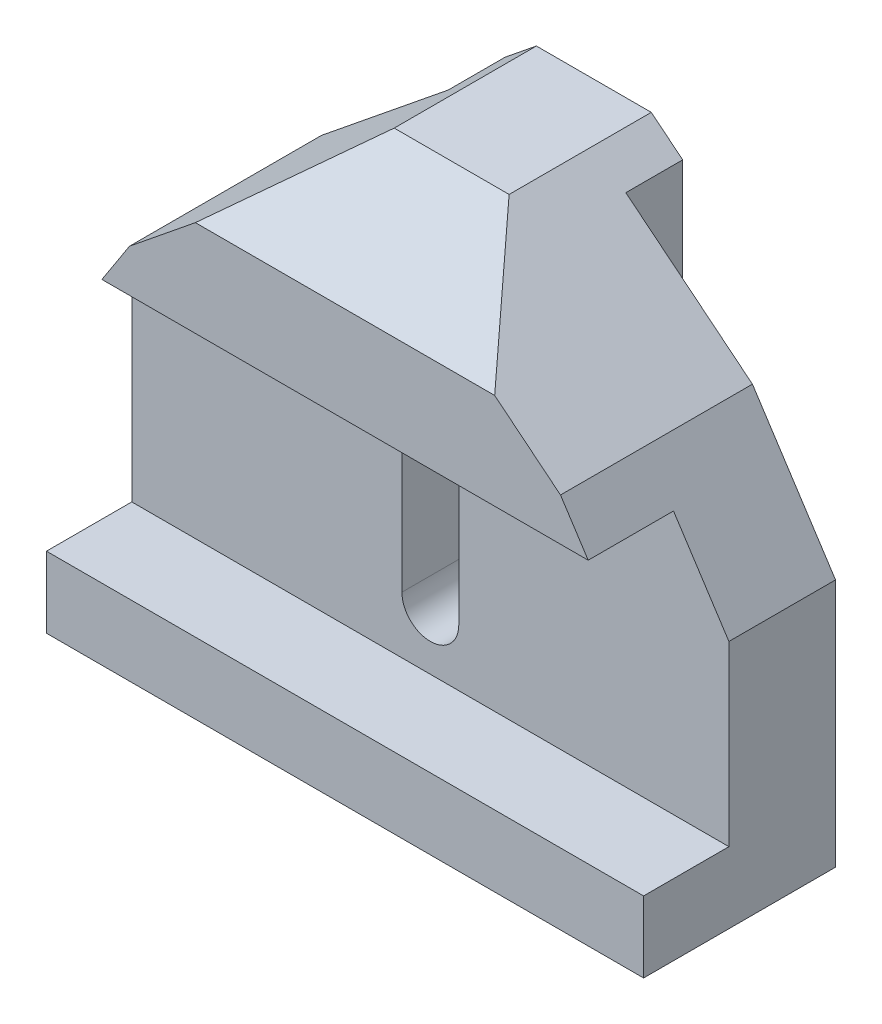
ISO-10303-21;
HEADER;
FILE_DESCRIPTION(('STEP AP214'),'2;1');
FILE_NAME('part.step','',(''),(''),'','','');
FILE_SCHEMA(('AUTOMOTIVE_DESIGN { 1 0 10303 214 1 1 1 1 }'));
ENDSEC;
DATA;
#1=APPLICATION_CONTEXT('core data for automotive mechanical design processes');
#2=APPLICATION_PROTOCOL_DEFINITION('international standard','automotive_design',2000,#1);
#3=PRODUCT_CONTEXT('',#1,'mechanical');
#4=PRODUCT('Part','Part','',(#3));
#5=PRODUCT_RELATED_PRODUCT_CATEGORY('part','',(#4));
#6=PRODUCT_DEFINITION_FORMATION('','',#4);
#7=PRODUCT_DEFINITION_CONTEXT('part definition',#1,'design');
#8=PRODUCT_DEFINITION('design','',#6,#7);
#9=PRODUCT_DEFINITION_SHAPE('','',#8);
#10=(LENGTH_UNIT() NAMED_UNIT(*) SI_UNIT(.MILLI.,.METRE.));
#11=(NAMED_UNIT(*) PLANE_ANGLE_UNIT() SI_UNIT($,.RADIAN.));
#12=(NAMED_UNIT(*) SI_UNIT($,.STERADIAN.) SOLID_ANGLE_UNIT());
#13=UNCERTAINTY_MEASURE_WITH_UNIT(LENGTH_MEASURE(1.E-05),#10,'distance_accuracy_value','');
#14=(GEOMETRIC_REPRESENTATION_CONTEXT(3) GLOBAL_UNCERTAINTY_ASSIGNED_CONTEXT((#13)) GLOBAL_UNIT_ASSIGNED_CONTEXT((#10,
#11,#12)) REPRESENTATION_CONTEXT('',''));
#15=CARTESIAN_POINT('',(0.,0.,0.));
#16=DIRECTION('',(0.,0.,1.));
#17=DIRECTION('',(1.,0.,0.));
#18=AXIS2_PLACEMENT_3D('',#15,#16,#17);
#19=CARTESIAN_POINT('',(12.5,71.,0.));
#20=DIRECTION('',(0.,-1.,0.));
#21=DIRECTION('',(0.,0.,-1.));
#22=AXIS2_PLACEMENT_3D('',#19,#20,#21);
#23=PLANE('',#22);
#24=DIRECTION('',(0.,0.,-1.));
#25=VECTOR('',#24,1.);
#26=CARTESIAN_POINT('',(-8.08251450481393,71.,35.001));
#27=LINE('',#26,#25);
#28=CARTESIAN_POINT('',(-8.08251450481393,71.,19.9999999999999));
#29=VERTEX_POINT('',#28);
#30=CARTESIAN_POINT('',(-8.08251450481393,71.,0.));
#31=VERTEX_POINT('',#30);
#32=EDGE_CURVE('E344',#29,#31,#27,.T.);
#33=ORIENTED_EDGE('',*,*,#32,.F.);
#34=DIRECTION('',(1.,0.,0.));
#35=VECTOR('',#34,1.);
#36=CARTESIAN_POINT('',(8.08251450481392,71.,19.9999999999999));
#37=LINE('',#36,#35);
#38=CARTESIAN_POINT('',(8.08251450481393,71.,19.9999999999999));
#39=VERTEX_POINT('',#38);
#40=EDGE_CURVE('E55',#29,#39,#37,.T.);
#41=ORIENTED_EDGE('',*,*,#40,.T.);
#42=DIRECTION('',(0.,0.,-1.));
#43=VECTOR('',#42,1.);
#44=CARTESIAN_POINT('',(8.08251450481393,71.,35.001));
#45=LINE('',#44,#43);
#46=CARTESIAN_POINT('',(8.08251450481393,71.,0.));
#47=VERTEX_POINT('',#46);
#48=EDGE_CURVE('E198',#39,#47,#45,.T.);
#49=ORIENTED_EDGE('',*,*,#48,.T.);
#50=DIRECTION('',(-1.,0.,0.));
#51=VECTOR('',#50,1.);
#52=CARTESIAN_POINT('',(12.5,71.,0.));
#53=LINE('',#52,#51);
#54=EDGE_CURVE('E257',#47,#31,#53,.T.);
#55=ORIENTED_EDGE('',*,*,#54,.T.);
#56=EDGE_LOOP('',(#33,#41,#49,#55));
#57=FACE_BOUND('',#56,.T.);
#58=ADVANCED_FACE('F43',(#57),#23,.F.);
#59=CARTESIAN_POINT('',(42.,0.,35.));
#60=DIRECTION('',(0.,0.,1.));
#61=DIRECTION('',(0.,-1.,0.));
#62=AXIS2_PLACEMENT_3D('',#59,#60,#61);
#63=PLANE('',#62);
#64=DIRECTION('',(0.777145961456972,-0.629320391049836,0.));
#65=VECTOR('',#64,1.);
#66=CARTESIAN_POINT('',(37.9252724500795,46.8338111094206,35.));
#67=LINE('',#66,#65);
#68=CARTESIAN_POINT('',(21.0527789736077,60.4968869268543,35.));
#69=VERTEX_POINT('',#68);
#70=CARTESIAN_POINT('',(30.310663322445,53.,35.));
#71=VERTEX_POINT('',#70);
#72=EDGE_CURVE('E281',#69,#71,#67,.T.);
#73=ORIENTED_EDGE('',*,*,#72,.F.);
#74=DIRECTION('',(-1.,0.,0.));
#75=VECTOR('',#74,1.);
#76=CARTESIAN_POINT('',(-8.08251450481393,60.4968869268543,35.));
#77=LINE('',#76,#75);
#78=CARTESIAN_POINT('',(-21.0527789736077,60.4968869268543,35.));
#79=VERTEX_POINT('',#78);
#80=EDGE_CURVE('E271',#69,#79,#77,.T.);
#81=ORIENTED_EDGE('',*,*,#80,.T.);
#82=DIRECTION('',(-0.777145961456972,-0.629320391049836,0.));
#83=VECTOR('',#82,1.);
#84=CARTESIAN_POINT('',(-37.9252724500795,46.8338111094206,35.));
#85=LINE('',#84,#83);
#86=CARTESIAN_POINT('',(-30.3106633224449,53.,35.));
#87=VERTEX_POINT('',#86);
#88=EDGE_CURVE('E276',#79,#87,#85,.T.);
#89=ORIENTED_EDGE('',*,*,#88,.T.);
#90=DIRECTION('',(-0.544639035015023,-0.838670567945427,0.));
#91=VECTOR('',#90,1.);
#92=CARTESIAN_POINT('',(-45.5285150133375,29.5665633566678,35.));
#93=LINE('',#92,#91);
#94=CARTESIAN_POINT('',(-34.20710888163,47.,35.));
#95=VERTEX_POINT('',#94);
#96=EDGE_CURVE('E332',#87,#95,#93,.T.);
#97=ORIENTED_EDGE('',*,*,#96,.T.);
#98=DIRECTION('',(-1.,0.,0.));
#99=VECTOR('',#98,1.);
#100=CARTESIAN_POINT('',(42.,47.,35.));
#101=LINE('',#100,#99);
#102=CARTESIAN_POINT('',(34.20710888163,47.,35.));
#103=VERTEX_POINT('',#102);
#104=EDGE_CURVE('E249',#103,#95,#101,.T.);
#105=ORIENTED_EDGE('',*,*,#104,.F.);
#106=DIRECTION('',(0.544639035015023,-0.838670567945427,0.));
#107=VECTOR('',#106,1.);
#108=CARTESIAN_POINT('',(45.5285150133375,29.5665633566678,35.));
#109=LINE('',#108,#107);
#110=EDGE_CURVE('E374',#71,#103,#109,.T.);
#111=ORIENTED_EDGE('',*,*,#110,.F.);
#112=EDGE_LOOP('',(#73,#81,#89,#97,#105,#111));
#113=FACE_BOUND('',#112,.T.);
#114=ADVANCED_FACE('F280',(#113),#63,.T.);
#115=CARTESIAN_POINT('',(12.5,0.,0.));
#116=DIRECTION('',(0.,0.,1.));
#117=DIRECTION('',(1.,0.,0.));
#118=AXIS2_PLACEMENT_3D('',#115,#116,#117);
#119=PLANE('',#118);
#120=CARTESIAN_POINT('',(0.,18.,0.));
#121=DIRECTION('',(0.,0.,1.));
#122=DIRECTION('',(1.,0.,0.));
#123=AXIS2_PLACEMENT_3D('',#120,#121,#122);
#124=CIRCLE('',#123,4.);
#125=CARTESIAN_POINT('',(-4.,18.,0.));
#126=VERTEX_POINT('',#125);
#127=CARTESIAN_POINT('',(4.,18.,0.));
#128=VERTEX_POINT('',#127);
#129=EDGE_CURVE('E320',#126,#128,#124,.T.);
#130=ORIENTED_EDGE('',*,*,#129,.T.);
#131=DIRECTION('',(0.,-1.,0.));
#132=VECTOR('',#131,1.);
#133=CARTESIAN_POINT('',(4.,39.,0.));
#134=LINE('',#133,#132);
#135=CARTESIAN_POINT('',(4.,39.,0.));
#136=VERTEX_POINT('',#135);
#137=EDGE_CURVE('E319',#136,#128,#134,.T.);
#138=ORIENTED_EDGE('',*,*,#137,.F.);
#139=CARTESIAN_POINT('',(0.,39.,0.));
#140=DIRECTION('',(0.,0.,1.));
#141=DIRECTION('',(1.,0.,0.));
#142=AXIS2_PLACEMENT_3D('',#139,#140,#141);
#143=CIRCLE('',#142,4.);
#144=CARTESIAN_POINT('',(-4.,39.,0.));
#145=VERTEX_POINT('',#144);
#146=EDGE_CURVE('E308',#136,#145,#143,.T.);
#147=ORIENTED_EDGE('',*,*,#146,.T.);
#148=DIRECTION('',(0.,-1.,0.));
#149=VECTOR('',#148,1.);
#150=CARTESIAN_POINT('',(-4.,39.,0.));
#151=LINE('',#150,#149);
#152=EDGE_CURVE('E314',#145,#126,#151,.T.);
#153=ORIENTED_EDGE('',*,*,#152,.T.);
#154=EDGE_LOOP('',(#130,#138,#147,#153));
#155=FACE_BOUND('',#154,.T.);
#156=ORIENTED_EDGE('',*,*,#54,.F.);
#157=DIRECTION('',(0.777145961456972,-0.629320391049836,0.));
#158=VECTOR('',#157,1.);
#159=CARTESIAN_POINT('',(37.9252724500795,46.8338111094206,0.));
#160=LINE('',#159,#158);
#161=CARTESIAN_POINT('',(12.5,67.4227907791278,0.));
#162=VERTEX_POINT('',#161);
#163=EDGE_CURVE('E206',#47,#162,#160,.T.);
#164=ORIENTED_EDGE('',*,*,#163,.T.);
#165=DIRECTION('',(0.,1.,0.));
#166=VECTOR('',#165,1.);
#167=CARTESIAN_POINT('',(12.5,0.,0.));
#168=LINE('',#167,#166);
#169=CARTESIAN_POINT('',(12.5,0.,0.));
#170=VERTEX_POINT('',#169);
#171=EDGE_CURVE('E260',#170,#162,#168,.T.);
#172=ORIENTED_EDGE('',*,*,#171,.F.);
#173=DIRECTION('',(-1.,0.,0.));
#174=VECTOR('',#173,1.);
#175=CARTESIAN_POINT('',(12.5,0.,0.));
#176=LINE('',#175,#174);
#177=CARTESIAN_POINT('',(-12.5,0.,0.));
#178=VERTEX_POINT('',#177);
#179=EDGE_CURVE('E268',#170,#178,#176,.T.);
#180=ORIENTED_EDGE('',*,*,#179,.T.);
#181=DIRECTION('',(0.,1.,0.));
#182=VECTOR('',#181,1.);
#183=CARTESIAN_POINT('',(-12.5,0.,0.));
#184=LINE('',#183,#182);
#185=CARTESIAN_POINT('',(-12.5,67.4227907791278,0.));
#186=VERTEX_POINT('',#185);
#187=EDGE_CURVE('E254',#178,#186,#184,.T.);
#188=ORIENTED_EDGE('',*,*,#187,.T.);
#189=DIRECTION('',(-0.777145961456972,-0.629320391049836,0.));
#190=VECTOR('',#189,1.);
#191=CARTESIAN_POINT('',(-37.9252724500795,46.8338111094206,0.));
#192=LINE('',#191,#190);
#193=EDGE_CURVE('E293',#31,#186,#192,.T.);
#194=ORIENTED_EDGE('',*,*,#193,.F.);
#195=EDGE_LOOP('',(#156,#164,#172,#180,#188,#194));
#196=FACE_BOUND('',#195,.T.);
#197=ADVANCED_FACE('F360',(#155,#196),#119,.F.);
#198=CARTESIAN_POINT('',(12.5,0.,0.));
#199=DIRECTION('',(1.,0.,0.));
#200=DIRECTION('',(0.,0.,-1.));
#201=AXIS2_PLACEMENT_3D('',#198,#199,#200);
#202=PLANE('',#201);
#203=ORIENTED_EDGE('',*,*,#171,.T.);
#204=DIRECTION('',(0.,0.,-1.));
#205=VECTOR('',#204,1.);
#206=CARTESIAN_POINT('',(12.5,67.4227907791278,35.001));
#207=LINE('',#206,#205);
#208=CARTESIAN_POINT('',(12.5,67.4227907791278,8.));
#209=VERTEX_POINT('',#208);
#210=EDGE_CURVE('E295',#209,#162,#207,.T.);
#211=ORIENTED_EDGE('',*,*,#210,.F.);
#212=DIRECTION('',(0.,-1.,0.));
#213=VECTOR('',#212,1.);
#214=CARTESIAN_POINT('',(12.5,0.,7.99999999999999));
#215=LINE('',#214,#213);
#216=CARTESIAN_POINT('',(12.5,0.,8.));
#217=VERTEX_POINT('',#216);
#218=EDGE_CURVE('E252',#209,#217,#215,.T.);
#219=ORIENTED_EDGE('',*,*,#218,.T.);
#220=DIRECTION('',(0.,0.,-1.));
#221=VECTOR('',#220,1.);
#222=CARTESIAN_POINT('',(12.5,0.,0.));
#223=LINE('',#222,#221);
#224=EDGE_CURVE('E255',#217,#170,#223,.T.);
#225=ORIENTED_EDGE('',*,*,#224,.T.);
#226=EDGE_LOOP('',(#203,#211,#219,#225));
#227=FACE_BOUND('',#226,.T.);
#228=ADVANCED_FACE('F394',(#227),#202,.T.);
#229=CARTESIAN_POINT('',(42.,0.,7.99999999999999));
#230=DIRECTION('',(0.,0.,-1.));
#231=DIRECTION('',(0.,1.,0.));
#232=AXIS2_PLACEMENT_3D('',#229,#230,#231);
#233=PLANE('',#232);
#234=DIRECTION('',(0.,-1.,0.));
#235=VECTOR('',#234,1.);
#236=CARTESIAN_POINT('',(-42.,0.,7.99999999999999));
#237=LINE('',#236,#235);
#238=CARTESIAN_POINT('',(-42.,35.,8.));
#239=VERTEX_POINT('',#238);
#240=CARTESIAN_POINT('',(-42.,0.,8.));
#241=VERTEX_POINT('',#240);
#242=EDGE_CURVE('E223',#239,#241,#237,.T.);
#243=ORIENTED_EDGE('',*,*,#242,.F.);
#244=DIRECTION('',(0.544639035015023,0.838670567945427,0.));
#245=VECTOR('',#244,1.);
#246=CARTESIAN_POINT('',(-45.5285150133375,29.5665633566678,7.99999999999999));
#247=LINE('',#246,#245);
#248=CARTESIAN_POINT('',(-30.310663322445,53.,8.));
#249=VERTEX_POINT('',#248);
#250=EDGE_CURVE('E327',#239,#249,#247,.T.);
#251=ORIENTED_EDGE('',*,*,#250,.T.);
#252=DIRECTION('',(0.777145961456972,0.629320391049836,0.));
#253=VECTOR('',#252,1.);
#254=CARTESIAN_POINT('',(-37.9252724500795,46.8338111094206,8.));
#255=LINE('',#254,#253);
#256=CARTESIAN_POINT('',(-12.5,67.4227907791278,8.));
#257=VERTEX_POINT('',#256);
#258=EDGE_CURVE('E288',#249,#257,#255,.T.);
#259=ORIENTED_EDGE('',*,*,#258,.T.);
#260=DIRECTION('',(0.,-1.,0.));
#261=VECTOR('',#260,1.);
#262=CARTESIAN_POINT('',(-12.5,0.,7.99999999999999));
#263=LINE('',#262,#261);
#264=CARTESIAN_POINT('',(-12.5,0.,8.));
#265=VERTEX_POINT('',#264);
#266=EDGE_CURVE('E253',#257,#265,#263,.T.);
#267=ORIENTED_EDGE('',*,*,#266,.T.);
#268=DIRECTION('',(-1.,0.,0.));
#269=VECTOR('',#268,1.);
#270=CARTESIAN_POINT('',(42.,0.,8.));
#271=LINE('',#270,#269);
#272=EDGE_CURVE('E221',#265,#241,#271,.T.);
#273=ORIENTED_EDGE('',*,*,#272,.T.);
#274=EDGE_LOOP('',(#243,#251,#259,#267,#273));
#275=FACE_BOUND('',#274,.T.);
#276=ADVANCED_FACE('F366',(#275),#233,.T.);
#277=CARTESIAN_POINT('',(42.,47.,0.));
#278=DIRECTION('',(0.,1.,0.));
#279=DIRECTION('',(0.,0.,1.));
#280=AXIS2_PLACEMENT_3D('',#277,#278,#279);
#281=PLANE('',#280);
#282=DIRECTION('',(0.,0.,1.));
#283=VECTOR('',#282,1.);
#284=CARTESIAN_POINT('',(34.20710888163,47.,35.001));
#285=LINE('',#284,#283);
#286=CARTESIAN_POINT('',(34.20710888163,47.,23.));
#287=VERTEX_POINT('',#286);
#288=EDGE_CURVE('E192',#287,#103,#285,.T.);
#289=ORIENTED_EDGE('',*,*,#288,.T.);
#290=ORIENTED_EDGE('',*,*,#104,.T.);
#291=DIRECTION('',(0.,0.,1.));
#292=VECTOR('',#291,1.);
#293=CARTESIAN_POINT('',(-34.20710888163,47.,35.001));
#294=LINE('',#293,#292);
#295=CARTESIAN_POINT('',(-34.2071088816299,47.,23.));
#296=VERTEX_POINT('',#295);
#297=EDGE_CURVE('E333',#296,#95,#294,.T.);
#298=ORIENTED_EDGE('',*,*,#297,.F.);
#299=DIRECTION('',(-1.,0.,0.));
#300=VECTOR('',#299,1.);
#301=CARTESIAN_POINT('',(42.,47.,23.));
#302=LINE('',#301,#300);
#303=EDGE_CURVE('E247',#287,#296,#302,.T.);
#304=ORIENTED_EDGE('',*,*,#303,.F.);
#305=EDGE_LOOP('',(#289,#290,#298,#304));
#306=FACE_BOUND('',#305,.T.);
#307=ADVANCED_FACE('F372',(#306),#281,.F.);
#308=CARTESIAN_POINT('',(42.,0.,23.));
#309=DIRECTION('',(0.,0.,-1.));
#310=DIRECTION('',(0.,1.,0.));
#311=AXIS2_PLACEMENT_3D('',#308,#309,#310);
#312=PLANE('',#311);
#313=DIRECTION('',(-0.544639035015023,0.838670567945427,0.));
#314=VECTOR('',#313,1.);
#315=CARTESIAN_POINT('',(45.5285150133375,29.5665633566678,23.));
#316=LINE('',#315,#314);
#317=CARTESIAN_POINT('',(42.,35.,23.));
#318=VERTEX_POINT('',#317);
#319=EDGE_CURVE('E184',#318,#287,#316,.T.);
#320=ORIENTED_EDGE('',*,*,#319,.T.);
#321=ORIENTED_EDGE('',*,*,#303,.T.);
#322=DIRECTION('',(0.544639035015023,0.838670567945427,0.));
#323=VECTOR('',#322,1.);
#324=CARTESIAN_POINT('',(-45.5285150133375,29.5665633566678,23.));
#325=LINE('',#324,#323);
#326=CARTESIAN_POINT('',(-42.,35.,23.));
#327=VERTEX_POINT('',#326);
#328=EDGE_CURVE('E342',#327,#296,#325,.T.);
#329=ORIENTED_EDGE('',*,*,#328,.F.);
#330=DIRECTION('',(0.,-1.,0.));
#331=VECTOR('',#330,1.);
#332=CARTESIAN_POINT('',(-42.,0.,23.));
#333=LINE('',#332,#331);
#334=CARTESIAN_POINT('',(-42.,10.,23.));
#335=VERTEX_POINT('',#334);
#336=EDGE_CURVE('E226',#327,#335,#333,.T.);
#337=ORIENTED_EDGE('',*,*,#336,.T.);
#338=DIRECTION('',(-1.,0.,0.));
#339=VECTOR('',#338,1.);
#340=CARTESIAN_POINT('',(42.,10.,23.));
#341=LINE('',#340,#339);
#342=CARTESIAN_POINT('',(42.,10.,23.));
#343=VERTEX_POINT('',#342);
#344=EDGE_CURVE('E211',#343,#335,#341,.T.);
#345=ORIENTED_EDGE('',*,*,#344,.F.);
#346=DIRECTION('',(0.,-1.,0.));
#347=VECTOR('',#346,1.);
#348=CARTESIAN_POINT('',(42.,0.,23.));
#349=LINE('',#348,#347);
#350=EDGE_CURVE('E203',#318,#343,#349,.T.);
#351=ORIENTED_EDGE('',*,*,#350,.F.);
#352=EDGE_LOOP('',(#320,#321,#329,#337,#345,#351));
#353=FACE_BOUND('',#352,.T.);
#354=CARTESIAN_POINT('',(0.,39.,23.));
#355=DIRECTION('',(0.,0.,-1.));
#356=DIRECTION('',(0.,1.,0.));
#357=AXIS2_PLACEMENT_3D('',#354,#355,#356);
#358=CIRCLE('',#357,4.);
#359=CARTESIAN_POINT('',(-4.,39.,23.));
#360=VERTEX_POINT('',#359);
#361=CARTESIAN_POINT('',(4.,39.,23.));
#362=VERTEX_POINT('',#361);
#363=EDGE_CURVE('E322',#360,#362,#358,.T.);
#364=ORIENTED_EDGE('',*,*,#363,.T.);
#365=DIRECTION('',(0.,1.,0.));
#366=VECTOR('',#365,1.);
#367=CARTESIAN_POINT('',(4.,39.,23.));
#368=LINE('',#367,#366);
#369=CARTESIAN_POINT('',(4.,18.,23.));
#370=VERTEX_POINT('',#369);
#371=EDGE_CURVE('E325',#370,#362,#368,.T.);
#372=ORIENTED_EDGE('',*,*,#371,.F.);
#373=CARTESIAN_POINT('',(0.,18.,23.));
#374=DIRECTION('',(0.,0.,-1.));
#375=DIRECTION('',(0.,1.,0.));
#376=AXIS2_PLACEMENT_3D('',#373,#374,#375);
#377=CIRCLE('',#376,4.);
#378=CARTESIAN_POINT('',(-4.,18.,23.));
#379=VERTEX_POINT('',#378);
#380=EDGE_CURVE('E298',#370,#379,#377,.T.);
#381=ORIENTED_EDGE('',*,*,#380,.T.);
#382=DIRECTION('',(0.,1.,0.));
#383=VECTOR('',#382,1.);
#384=CARTESIAN_POINT('',(-4.,39.,23.));
#385=LINE('',#384,#383);
#386=EDGE_CURVE('E326',#379,#360,#385,.T.);
#387=ORIENTED_EDGE('',*,*,#386,.T.);
#388=EDGE_LOOP('',(#364,#372,#381,#387));
#389=FACE_BOUND('',#388,.T.);
#390=ADVANCED_FACE('F208',(#353,#389),#312,.F.);
#391=CARTESIAN_POINT('',(12.5,0.,0.));
#392=DIRECTION('',(0.,1.,0.));
#393=DIRECTION('',(0.,0.,1.));
#394=AXIS2_PLACEMENT_3D('',#391,#392,#393);
#395=PLANE('',#394);
#396=DIRECTION('',(0.,0.,-1.));
#397=VECTOR('',#396,1.);
#398=CARTESIAN_POINT('',(-12.5,0.,0.));
#399=LINE('',#398,#397);
#400=EDGE_CURVE('E265',#265,#178,#399,.T.);
#401=ORIENTED_EDGE('',*,*,#400,.T.);
#402=ORIENTED_EDGE('',*,*,#179,.F.);
#403=ORIENTED_EDGE('',*,*,#224,.F.);
#404=CARTESIAN_POINT('',(42.,0.,8.));
#405=VERTEX_POINT('',#404);
#406=EDGE_CURVE('E237',#405,#217,#271,.T.);
#407=ORIENTED_EDGE('',*,*,#406,.F.);
#408=DIRECTION('',(0.,0.,-1.));
#409=VECTOR('',#408,1.);
#410=CARTESIAN_POINT('',(42.,0.,0.));
#411=LINE('',#410,#409);
#412=CARTESIAN_POINT('',(42.,0.,35.));
#413=VERTEX_POINT('',#412);
#414=EDGE_CURVE('E225',#413,#405,#411,.T.);
#415=ORIENTED_EDGE('',*,*,#414,.F.);
#416=DIRECTION('',(-1.,0.,0.));
#417=VECTOR('',#416,1.);
#418=CARTESIAN_POINT('',(42.,0.,35.));
#419=LINE('',#418,#417);
#420=CARTESIAN_POINT('',(-42.,0.,35.));
#421=VERTEX_POINT('',#420);
#422=EDGE_CURVE('E239',#413,#421,#419,.T.);
#423=ORIENTED_EDGE('',*,*,#422,.T.);
#424=DIRECTION('',(0.,0.,-1.));
#425=VECTOR('',#424,1.);
#426=CARTESIAN_POINT('',(-42.,0.,0.));
#427=LINE('',#426,#425);
#428=EDGE_CURVE('E220',#421,#241,#427,.T.);
#429=ORIENTED_EDGE('',*,*,#428,.T.);
#430=ORIENTED_EDGE('',*,*,#272,.F.);
#431=EDGE_LOOP('',(#401,#402,#403,#407,#415,#423,#429,#430));
#432=FACE_BOUND('',#431,.T.);
#433=ADVANCED_FACE('F361',(#432),#395,.F.);
#434=CARTESIAN_POINT('',(-12.5,0.,0.));
#435=DIRECTION('',(1.,0.,0.));
#436=DIRECTION('',(0.,0.,-1.));
#437=AXIS2_PLACEMENT_3D('',#434,#435,#436);
#438=PLANE('',#437);
#439=ORIENTED_EDGE('',*,*,#266,.F.);
#440=DIRECTION('',(0.,0.,1.));
#441=VECTOR('',#440,1.);
#442=CARTESIAN_POINT('',(-12.5,67.4227907791278,35.001));
#443=LINE('',#442,#441);
#444=EDGE_CURVE('E286',#186,#257,#443,.T.);
#445=ORIENTED_EDGE('',*,*,#444,.F.);
#446=ORIENTED_EDGE('',*,*,#187,.F.);
#447=ORIENTED_EDGE('',*,*,#400,.F.);
#448=EDGE_LOOP('',(#439,#445,#446,#447));
#449=FACE_BOUND('',#448,.T.);
#450=ADVANCED_FACE('F352',(#449),#438,.F.);
#451=DIRECTION('',(-0.544639035015023,0.838670567945427,0.));
#452=VECTOR('',#451,1.);
#453=CARTESIAN_POINT('',(45.5285150133375,29.5665633566678,7.99999999999999));
#454=LINE('',#453,#452);
#455=CARTESIAN_POINT('',(42.,35.,8.));
#456=VERTEX_POINT('',#455);
#457=CARTESIAN_POINT('',(30.310663322445,53.,7.99999999999999));
#458=VERTEX_POINT('',#457);
#459=EDGE_CURVE('E230',#456,#458,#454,.T.);
#460=ORIENTED_EDGE('',*,*,#459,.F.);
#461=DIRECTION('',(0.,-1.,0.));
#462=VECTOR('',#461,1.);
#463=CARTESIAN_POINT('',(42.,0.,7.99999999999999));
#464=LINE('',#463,#462);
#465=EDGE_CURVE('E204',#456,#405,#464,.T.);
#466=ORIENTED_EDGE('',*,*,#465,.T.);
#467=ORIENTED_EDGE('',*,*,#406,.T.);
#468=ORIENTED_EDGE('',*,*,#218,.F.);
#469=DIRECTION('',(-0.777145961456972,0.629320391049836,0.));
#470=VECTOR('',#469,1.);
#471=CARTESIAN_POINT('',(37.9252724500795,46.8338111094206,8.));
#472=LINE('',#471,#470);
#473=EDGE_CURVE('E381',#458,#209,#472,.T.);
#474=ORIENTED_EDGE('',*,*,#473,.F.);
#475=EDGE_LOOP('',(#460,#466,#467,#468,#474));
#476=FACE_BOUND('',#475,.T.);
#477=ADVANCED_FACE('F395',(#476),#233,.T.);
#478=CARTESIAN_POINT('',(42.,10.,0.));
#479=DIRECTION('',(0.,-1.,0.));
#480=DIRECTION('',(0.,0.,-1.));
#481=AXIS2_PLACEMENT_3D('',#478,#479,#480);
#482=PLANE('',#481);
#483=DIRECTION('',(0.,0.,1.));
#484=VECTOR('',#483,1.);
#485=CARTESIAN_POINT('',(-42.,10.,0.));
#486=LINE('',#485,#484);
#487=CARTESIAN_POINT('',(-42.,10.,35.));
#488=VERTEX_POINT('',#487);
#489=EDGE_CURVE('E227',#335,#488,#486,.T.);
#490=ORIENTED_EDGE('',*,*,#489,.T.);
#491=DIRECTION('',(-1.,0.,0.));
#492=VECTOR('',#491,1.);
#493=CARTESIAN_POINT('',(42.,10.,35.));
#494=LINE('',#493,#492);
#495=CARTESIAN_POINT('',(42.,10.,35.));
#496=VERTEX_POINT('',#495);
#497=EDGE_CURVE('E241',#496,#488,#494,.T.);
#498=ORIENTED_EDGE('',*,*,#497,.F.);
#499=DIRECTION('',(0.,0.,1.));
#500=VECTOR('',#499,1.);
#501=CARTESIAN_POINT('',(42.,10.,0.));
#502=LINE('',#501,#500);
#503=EDGE_CURVE('E213',#343,#496,#502,.T.);
#504=ORIENTED_EDGE('',*,*,#503,.F.);
#505=ORIENTED_EDGE('',*,*,#344,.T.);
#506=EDGE_LOOP('',(#490,#498,#504,#505));
#507=FACE_BOUND('',#506,.T.);
#508=ADVANCED_FACE('F406',(#507),#482,.F.);
#509=CARTESIAN_POINT('',(42.,0.,35.));
#510=DIRECTION('',(0.,0.,-1.));
#511=DIRECTION('',(-1.,0.,0.));
#512=AXIS2_PLACEMENT_3D('',#509,#510,#511);
#513=PLANE('',#512);
#514=DIRECTION('',(0.,-1.,0.));
#515=VECTOR('',#514,1.);
#516=CARTESIAN_POINT('',(-42.,0.,35.));
#517=LINE('',#516,#515);
#518=EDGE_CURVE('E235',#488,#421,#517,.T.);
#519=ORIENTED_EDGE('',*,*,#518,.T.);
#520=ORIENTED_EDGE('',*,*,#422,.F.);
#521=DIRECTION('',(0.,-1.,0.));
#522=VECTOR('',#521,1.);
#523=CARTESIAN_POINT('',(42.,0.,35.));
#524=LINE('',#523,#522);
#525=EDGE_CURVE('E214',#496,#413,#524,.T.);
#526=ORIENTED_EDGE('',*,*,#525,.F.);
#527=ORIENTED_EDGE('',*,*,#497,.T.);
#528=EDGE_LOOP('',(#519,#520,#526,#527));
#529=FACE_BOUND('',#528,.T.);
#530=ADVANCED_FACE('F396',(#529),#513,.F.);
#531=CARTESIAN_POINT('',(42.,0.,0.));
#532=DIRECTION('',(1.,0.,0.));
#533=DIRECTION('',(0.,0.,-1.));
#534=AXIS2_PLACEMENT_3D('',#531,#532,#533);
#535=PLANE('',#534);
#536=DIRECTION('',(0.,0.,-1.));
#537=VECTOR('',#536,1.);
#538=CARTESIAN_POINT('',(42.,35.,35.001));
#539=LINE('',#538,#537);
#540=EDGE_CURVE('E190',#318,#456,#539,.T.);
#541=ORIENTED_EDGE('',*,*,#540,.F.);
#542=ORIENTED_EDGE('',*,*,#350,.T.);
#543=ORIENTED_EDGE('',*,*,#503,.T.);
#544=ORIENTED_EDGE('',*,*,#525,.T.);
#545=ORIENTED_EDGE('',*,*,#414,.T.);
#546=ORIENTED_EDGE('',*,*,#465,.F.);
#547=EDGE_LOOP('',(#541,#542,#543,#544,#545,#546));
#548=FACE_BOUND('',#547,.T.);
#549=ADVANCED_FACE('F199',(#548),#535,.T.);
#550=CARTESIAN_POINT('',(-42.,0.,0.));
#551=DIRECTION('',(1.,0.,0.));
#552=DIRECTION('',(0.,0.,-1.));
#553=AXIS2_PLACEMENT_3D('',#550,#551,#552);
#554=PLANE('',#553);
#555=ORIENTED_EDGE('',*,*,#336,.F.);
#556=DIRECTION('',(0.,0.,-1.));
#557=VECTOR('',#556,1.);
#558=CARTESIAN_POINT('',(-42.,35.,35.001));
#559=LINE('',#558,#557);
#560=EDGE_CURVE('E343',#327,#239,#559,.T.);
#561=ORIENTED_EDGE('',*,*,#560,.T.);
#562=ORIENTED_EDGE('',*,*,#242,.T.);
#563=ORIENTED_EDGE('',*,*,#428,.F.);
#564=ORIENTED_EDGE('',*,*,#518,.F.);
#565=ORIENTED_EDGE('',*,*,#489,.F.);
#566=EDGE_LOOP('',(#555,#561,#562,#563,#564,#565));
#567=FACE_BOUND('',#566,.T.);
#568=ADVANCED_FACE('F404',(#567),#554,.F.);
#569=CARTESIAN_POINT('',(4.,39.,35.001));
#570=DIRECTION('',(1.,0.,0.));
#571=DIRECTION('',(0.,1.,0.));
#572=AXIS2_PLACEMENT_3D('',#569,#570,#571);
#573=PLANE('',#572);
#574=ORIENTED_EDGE('',*,*,#371,.T.);
#575=DIRECTION('',(0.,0.,-1.));
#576=VECTOR('',#575,1.);
#577=CARTESIAN_POINT('',(4.,39.,35.001));
#578=LINE('',#577,#576);
#579=EDGE_CURVE('E305',#362,#136,#578,.T.);
#580=ORIENTED_EDGE('',*,*,#579,.T.);
#581=ORIENTED_EDGE('',*,*,#137,.T.);
#582=DIRECTION('',(0.,0.,-1.));
#583=VECTOR('',#582,1.);
#584=CARTESIAN_POINT('',(4.,18.,35.001));
#585=LINE('',#584,#583);
#586=EDGE_CURVE('E304',#370,#128,#585,.T.);
#587=ORIENTED_EDGE('',*,*,#586,.F.);
#588=EDGE_LOOP('',(#574,#580,#581,#587));
#589=FACE_BOUND('',#588,.T.);
#590=ADVANCED_FACE('F469',(#589),#573,.F.);
#591=CARTESIAN_POINT('',(0.,39.,35.001));
#592=DIRECTION('',(0.,0.,-1.));
#593=DIRECTION('',(-1.,0.,0.));
#594=AXIS2_PLACEMENT_3D('',#591,#592,#593);
#595=CYLINDRICAL_SURFACE('',#594,4.);
#596=DIRECTION('',(0.,0.,-1.));
#597=VECTOR('',#596,1.);
#598=CARTESIAN_POINT('',(-4.,39.,35.001));
#599=LINE('',#598,#597);
#600=EDGE_CURVE('E310',#360,#145,#599,.T.);
#601=ORIENTED_EDGE('',*,*,#600,.T.);
#602=ORIENTED_EDGE('',*,*,#146,.F.);
#603=ORIENTED_EDGE('',*,*,#579,.F.);
#604=ORIENTED_EDGE('',*,*,#363,.F.);
#605=EDGE_LOOP('',(#601,#602,#603,#604));
#606=FACE_BOUND('',#605,.T.);
#607=ADVANCED_FACE('F478',(#606),#595,.F.);
#608=CARTESIAN_POINT('',(-4.,39.,35.001));
#609=DIRECTION('',(1.,0.,0.));
#610=DIRECTION('',(0.,1.,0.));
#611=AXIS2_PLACEMENT_3D('',#608,#609,#610);
#612=PLANE('',#611);
#613=DIRECTION('',(0.,0.,-1.));
#614=VECTOR('',#613,1.);
#615=CARTESIAN_POINT('',(-4.,18.,35.001));
#616=LINE('',#615,#614);
#617=EDGE_CURVE('E307',#379,#126,#616,.T.);
#618=ORIENTED_EDGE('',*,*,#617,.T.);
#619=ORIENTED_EDGE('',*,*,#152,.F.);
#620=ORIENTED_EDGE('',*,*,#600,.F.);
#621=ORIENTED_EDGE('',*,*,#386,.F.);
#622=EDGE_LOOP('',(#618,#619,#620,#621));
#623=FACE_BOUND('',#622,.T.);
#624=ADVANCED_FACE('F486',(#623),#612,.T.);
#625=CARTESIAN_POINT('',(0.,18.,35.001));
#626=DIRECTION('',(0.,0.,-1.));
#627=DIRECTION('',(-1.,0.,0.));
#628=AXIS2_PLACEMENT_3D('',#625,#626,#627);
#629=CYLINDRICAL_SURFACE('',#628,4.);
#630=ORIENTED_EDGE('',*,*,#586,.T.);
#631=ORIENTED_EDGE('',*,*,#129,.F.);
#632=ORIENTED_EDGE('',*,*,#617,.F.);
#633=ORIENTED_EDGE('',*,*,#380,.F.);
#634=EDGE_LOOP('',(#630,#631,#632,#633));
#635=FACE_BOUND('',#634,.T.);
#636=ADVANCED_FACE('F494',(#635),#629,.F.);
#637=CARTESIAN_POINT('',(-37.9252724500795,46.8338111094206,35.001));
#638=DIRECTION('',(0.629320391049836,-0.777145961456972,0.));
#639=DIRECTION('',(0.777145961456972,0.629320391049836,0.));
#640=AXIS2_PLACEMENT_3D('',#637,#638,#639);
#641=PLANE('',#640);
#642=ORIENTED_EDGE('',*,*,#88,.F.);
#643=DIRECTION('',(0.578003525978809,0.468058026468053,-0.668456137540001));
#644=VECTOR('',#643,1.);
#645=CARTESIAN_POINT('',(0.0124026429084087,77.555134656262,10.6382975067331));
#646=LINE('',#645,#644);
#647=EDGE_CURVE('E67',#79,#29,#646,.T.);
#648=ORIENTED_EDGE('',*,*,#647,.T.);
#649=ORIENTED_EDGE('',*,*,#32,.T.);
#650=ORIENTED_EDGE('',*,*,#193,.T.);
#651=ORIENTED_EDGE('',*,*,#444,.T.);
#652=ORIENTED_EDGE('',*,*,#258,.F.);
#653=DIRECTION('',(0.,0.,-1.));
#654=VECTOR('',#653,1.);
#655=CARTESIAN_POINT('',(-30.3106633224449,53.,35.001));
#656=LINE('',#655,#654);
#657=EDGE_CURVE('E290',#87,#249,#656,.T.);
#658=ORIENTED_EDGE('',*,*,#657,.F.);
#659=EDGE_LOOP('',(#642,#648,#649,#650,#651,#652,#658));
#660=FACE_BOUND('',#659,.T.);
#661=ADVANCED_FACE('F282',(#660),#641,.F.);
#662=CARTESIAN_POINT('',(-45.5285150133375,29.5665633566678,35.001));
#663=DIRECTION('',(0.838670567945427,-0.544639035015023,0.));
#664=DIRECTION('',(0.544639035015023,0.838670567945427,0.));
#665=AXIS2_PLACEMENT_3D('',#662,#663,#664);
#666=PLANE('',#665);
#667=ORIENTED_EDGE('',*,*,#560,.F.);
#668=ORIENTED_EDGE('',*,*,#328,.T.);
#669=ORIENTED_EDGE('',*,*,#297,.T.);
#670=ORIENTED_EDGE('',*,*,#96,.F.);
#671=ORIENTED_EDGE('',*,*,#657,.T.);
#672=ORIENTED_EDGE('',*,*,#250,.F.);
#673=EDGE_LOOP('',(#667,#668,#669,#670,#671,#672));
#674=FACE_BOUND('',#673,.T.);
#675=ADVANCED_FACE('F367',(#674),#666,.F.);
#676=CARTESIAN_POINT('',(37.9252724500795,46.8338111094206,35.001));
#677=DIRECTION('',(0.629320391049836,0.777145961456972,0.));
#678=DIRECTION('',(-0.777145961456972,0.629320391049836,0.));
#679=AXIS2_PLACEMENT_3D('',#676,#677,#678);
#680=PLANE('',#679);
#681=ORIENTED_EDGE('',*,*,#48,.F.);
#682=DIRECTION('',(0.578003525978809,-0.468058026468053,0.668456137540001));
#683=VECTOR('',#682,1.);
#684=CARTESIAN_POINT('',(30.3864616871588,52.9386196945125,45.7943242822934));
#685=LINE('',#684,#683);
#686=EDGE_CURVE('E11',#39,#69,#685,.T.);
#687=ORIENTED_EDGE('',*,*,#686,.T.);
#688=ORIENTED_EDGE('',*,*,#72,.T.);
#689=DIRECTION('',(0.,0.,-1.));
#690=VECTOR('',#689,1.);
#691=CARTESIAN_POINT('',(30.310663322445,53.,35.001));
#692=LINE('',#691,#690);
#693=EDGE_CURVE('E202',#71,#458,#692,.T.);
#694=ORIENTED_EDGE('',*,*,#693,.T.);
#695=ORIENTED_EDGE('',*,*,#473,.T.);
#696=ORIENTED_EDGE('',*,*,#210,.T.);
#697=ORIENTED_EDGE('',*,*,#163,.F.);
#698=EDGE_LOOP('',(#681,#687,#688,#694,#695,#696,#697));
#699=FACE_BOUND('',#698,.T.);
#700=ADVANCED_FACE('F390',(#699),#680,.T.);
#701=CARTESIAN_POINT('',(45.5285150133375,29.5665633566678,35.001));
#702=DIRECTION('',(0.838670567945427,0.544639035015023,0.));
#703=DIRECTION('',(-0.544639035015023,0.838670567945427,0.));
#704=AXIS2_PLACEMENT_3D('',#701,#702,#703);
#705=PLANE('',#704);
#706=ORIENTED_EDGE('',*,*,#459,.T.);
#707=ORIENTED_EDGE('',*,*,#693,.F.);
#708=ORIENTED_EDGE('',*,*,#110,.T.);
#709=ORIENTED_EDGE('',*,*,#288,.F.);
#710=ORIENTED_EDGE('',*,*,#319,.F.);
#711=ORIENTED_EDGE('',*,*,#540,.T.);
#712=EDGE_LOOP('',(#706,#707,#708,#709,#710,#711));
#713=FACE_BOUND('',#712,.T.);
#714=ADVANCED_FACE('F186',(#713),#705,.T.);
#715=CARTESIAN_POINT('',(42.,60.4968869268543,35.));
#716=DIRECTION('',(0.,0.819152044288993,0.573576436351044));
#717=DIRECTION('',(1.,0.,0.));
#718=AXIS2_PLACEMENT_3D('',#715,#716,#717);
#719=PLANE('',#718);
#720=ORIENTED_EDGE('',*,*,#686,.F.);
#721=ORIENTED_EDGE('',*,*,#40,.F.);
#722=ORIENTED_EDGE('',*,*,#647,.F.);
#723=ORIENTED_EDGE('',*,*,#80,.F.);
#724=EDGE_LOOP('',(#720,#721,#722,#723));
#725=FACE_BOUND('',#724,.T.);
#726=ADVANCED_FACE('F46',(#725),#719,.T.);
#727=CLOSED_SHELL('',(#58,#114,#197,#228,#276,#307,#390,#433,#450,#477,#508,#530,#549,#568,#590,
#607,#624,#636,#661,#675,#700,#714,#726));
#728=MANIFOLD_SOLID_BREP('B2',#727);
#729=ADVANCED_BREP_SHAPE_REPRESENTATION('',(#18,#728),#14);
#730=SHAPE_DEFINITION_REPRESENTATION(#9,#729);
ENDSEC;
END-ISO-10303-21;
